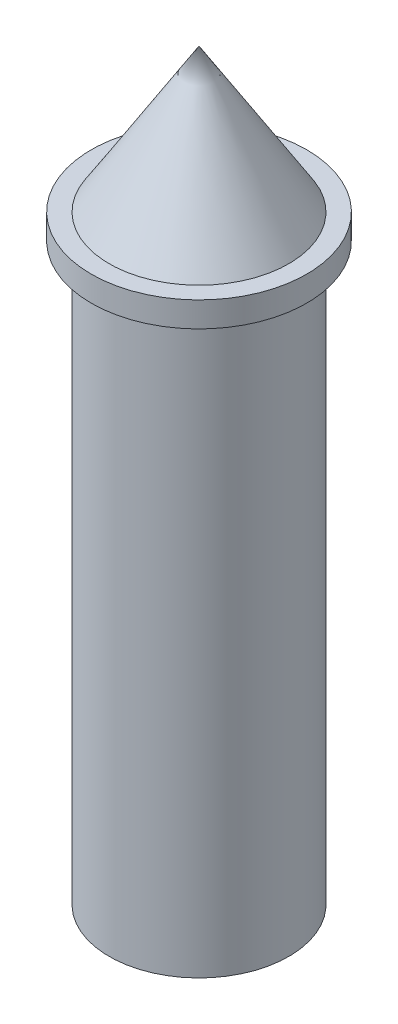
ISO-10303-21;
HEADER;
FILE_DESCRIPTION(('STEP AP214'),'2;1');
FILE_NAME('part.step','',(''),(''),'','','');
FILE_SCHEMA(('AUTOMOTIVE_DESIGN { 1 0 10303 214 1 1 1 1 }'));
ENDSEC;
DATA;
#1=APPLICATION_CONTEXT('core data for automotive mechanical design processes');
#2=APPLICATION_PROTOCOL_DEFINITION('international standard','automotive_design',2000,#1);
#3=PRODUCT_CONTEXT('',#1,'mechanical');
#4=PRODUCT('Part','Part','',(#3));
#5=PRODUCT_RELATED_PRODUCT_CATEGORY('part','',(#4));
#6=PRODUCT_DEFINITION_FORMATION('','',#4);
#7=PRODUCT_DEFINITION_CONTEXT('part definition',#1,'design');
#8=PRODUCT_DEFINITION('design','',#6,#7);
#9=PRODUCT_DEFINITION_SHAPE('','',#8);
#10=(LENGTH_UNIT() NAMED_UNIT(*) SI_UNIT(.MILLI.,.METRE.));
#11=(NAMED_UNIT(*) PLANE_ANGLE_UNIT() SI_UNIT($,.RADIAN.));
#12=(NAMED_UNIT(*) SI_UNIT($,.STERADIAN.) SOLID_ANGLE_UNIT());
#13=UNCERTAINTY_MEASURE_WITH_UNIT(LENGTH_MEASURE(1.E-05),#10,'distance_accuracy_value','');
#14=(GEOMETRIC_REPRESENTATION_CONTEXT(3) GLOBAL_UNCERTAINTY_ASSIGNED_CONTEXT((#13)) GLOBAL_UNIT_ASSIGNED_CONTEXT((#10,
#11,#12)) REPRESENTATION_CONTEXT('',''));
#15=CARTESIAN_POINT('',(0.,0.,0.));
#16=DIRECTION('',(0.,0.,1.));
#17=DIRECTION('',(1.,0.,0.));
#18=AXIS2_PLACEMENT_3D('',#15,#16,#17);
#19=CARTESIAN_POINT('',(0.,0.,0.));
#20=DIRECTION('',(0.,-1.,0.));
#21=DIRECTION('',(0.,0.,-1.));
#22=AXIS2_PLACEMENT_3D('',#19,#20,#21);
#23=PLANE('',#22);
#24=CARTESIAN_POINT('',(0.,0.,0.));
#25=DIRECTION('',(0.,-1.,0.));
#26=DIRECTION('',(0.,0.,-1.));
#27=AXIS2_PLACEMENT_3D('',#24,#25,#26);
#28=CIRCLE('',#27,31.75);
#29=CARTESIAN_POINT('',(0.,0.,-31.75));
#30=VERTEX_POINT('',#29);
#31=EDGE_CURVE('E62',#30,#30,#28,.T.);
#32=ORIENTED_EDGE('',*,*,#31,.T.);
#33=EDGE_LOOP('',(#32));
#34=FACE_BOUND('',#33,.T.);
#35=ADVANCED_FACE('F33',(#34),#23,.T.);
#36=CARTESIAN_POINT('',(0.,212.09,0.));
#37=DIRECTION('',(0.,-1.,0.));
#38=DIRECTION('',(0.,0.,-1.));
#39=AXIS2_PLACEMENT_3D('',#36,#37,#38);
#40=CONICAL_SURFACE('',#39,31.75,0.558599315343563);
#41=CARTESIAN_POINT('',(0.,262.89,0.));
#42=VERTEX_POINT('',#41);
#43=VERTEX_LOOP('',#42);
#44=FACE_BOUND('',#43,.T.);
#45=CARTESIAN_POINT('',(0.,212.09,0.));
#46=DIRECTION('',(0.,-1.,0.));
#47=DIRECTION('',(0.,0.,-1.));
#48=AXIS2_PLACEMENT_3D('',#45,#46,#47);
#49=CIRCLE('',#48,31.75);
#50=CARTESIAN_POINT('',(0.,212.09,-31.75));
#51=VERTEX_POINT('',#50);
#52=EDGE_CURVE('E11',#51,#51,#49,.T.);
#53=ORIENTED_EDGE('',*,*,#52,.F.);
#54=EDGE_LOOP('',(#53));
#55=FACE_BOUND('',#54,.T.);
#56=ADVANCED_FACE('F42',(#44,#55),#40,.T.);
#57=CARTESIAN_POINT('',(31.75,212.09,0.));
#58=DIRECTION('',(0.,1.,0.));
#59=DIRECTION('',(0.,0.,1.));
#60=AXIS2_PLACEMENT_3D('',#57,#58,#59);
#61=PLANE('',#60);
#62=ORIENTED_EDGE('',*,*,#52,.T.);
#63=EDGE_LOOP('',(#62));
#64=FACE_BOUND('',#63,.T.);
#65=CARTESIAN_POINT('',(0.,212.09,0.));
#66=DIRECTION('',(0.,-1.,0.));
#67=DIRECTION('',(0.,0.,-1.));
#68=AXIS2_PLACEMENT_3D('',#65,#66,#67);
#69=CIRCLE('',#68,38.1);
#70=CARTESIAN_POINT('',(0.,212.09,-38.1));
#71=VERTEX_POINT('',#70);
#72=EDGE_CURVE('E39',#71,#71,#69,.T.);
#73=ORIENTED_EDGE('',*,*,#72,.F.);
#74=EDGE_LOOP('',(#73));
#75=FACE_BOUND('',#74,.T.);
#76=ADVANCED_FACE('F45',(#64,#75),#61,.T.);
#77=CARTESIAN_POINT('',(0.,0.,0.));
#78=DIRECTION('',(0.,-1.,0.));
#79=DIRECTION('',(0.,0.,-1.));
#80=AXIS2_PLACEMENT_3D('',#77,#78,#79);
#81=CYLINDRICAL_SURFACE('',#80,38.1);
#82=ORIENTED_EDGE('',*,*,#72,.T.);
#83=EDGE_LOOP('',(#82));
#84=FACE_BOUND('',#83,.T.);
#85=CARTESIAN_POINT('',(0.,203.2,0.));
#86=DIRECTION('',(0.,-1.,0.));
#87=DIRECTION('',(0.,0.,-1.));
#88=AXIS2_PLACEMENT_3D('',#85,#86,#87);
#89=CIRCLE('',#88,38.1);
#90=CARTESIAN_POINT('',(0.,203.2,-38.1));
#91=VERTEX_POINT('',#90);
#92=EDGE_CURVE('E55',#91,#91,#89,.T.);
#93=ORIENTED_EDGE('',*,*,#92,.F.);
#94=EDGE_LOOP('',(#93));
#95=FACE_BOUND('',#94,.T.);
#96=ADVANCED_FACE('F50',(#84,#95),#81,.T.);
#97=CARTESIAN_POINT('',(31.75,203.2,0.));
#98=DIRECTION('',(0.,-1.,0.));
#99=DIRECTION('',(0.,0.,-1.));
#100=AXIS2_PLACEMENT_3D('',#97,#98,#99);
#101=PLANE('',#100);
#102=ORIENTED_EDGE('',*,*,#92,.T.);
#103=EDGE_LOOP('',(#102));
#104=FACE_BOUND('',#103,.T.);
#105=CARTESIAN_POINT('',(0.,203.2,0.));
#106=DIRECTION('',(0.,-1.,0.));
#107=DIRECTION('',(0.,0.,-1.));
#108=AXIS2_PLACEMENT_3D('',#105,#106,#107);
#109=CIRCLE('',#108,31.75);
#110=CARTESIAN_POINT('',(0.,203.2,-31.75));
#111=VERTEX_POINT('',#110);
#112=EDGE_CURVE('E57',#111,#111,#109,.T.);
#113=ORIENTED_EDGE('',*,*,#112,.F.);
#114=EDGE_LOOP('',(#113));
#115=FACE_BOUND('',#114,.T.);
#116=ADVANCED_FACE('F69',(#104,#115),#101,.T.);
#117=CARTESIAN_POINT('',(0.,0.,0.));
#118=DIRECTION('',(0.,-1.,0.));
#119=DIRECTION('',(0.,0.,-1.));
#120=AXIS2_PLACEMENT_3D('',#117,#118,#119);
#121=CYLINDRICAL_SURFACE('',#120,31.75);
#122=ORIENTED_EDGE('',*,*,#112,.T.);
#123=EDGE_LOOP('',(#122));
#124=FACE_BOUND('',#123,.T.);
#125=ORIENTED_EDGE('',*,*,#31,.F.);
#126=EDGE_LOOP('',(#125));
#127=FACE_BOUND('',#126,.T.);
#128=ADVANCED_FACE('F67',(#124,#127),#121,.T.);
#129=CLOSED_SHELL('',(#35,#56,#76,#96,#116,#128));
#130=MANIFOLD_SOLID_BREP('B2',#129);
#131=ADVANCED_BREP_SHAPE_REPRESENTATION('',(#18,#130),#14);
#132=SHAPE_DEFINITION_REPRESENTATION(#9,#131);
ENDSEC;
END-ISO-10303-21;
